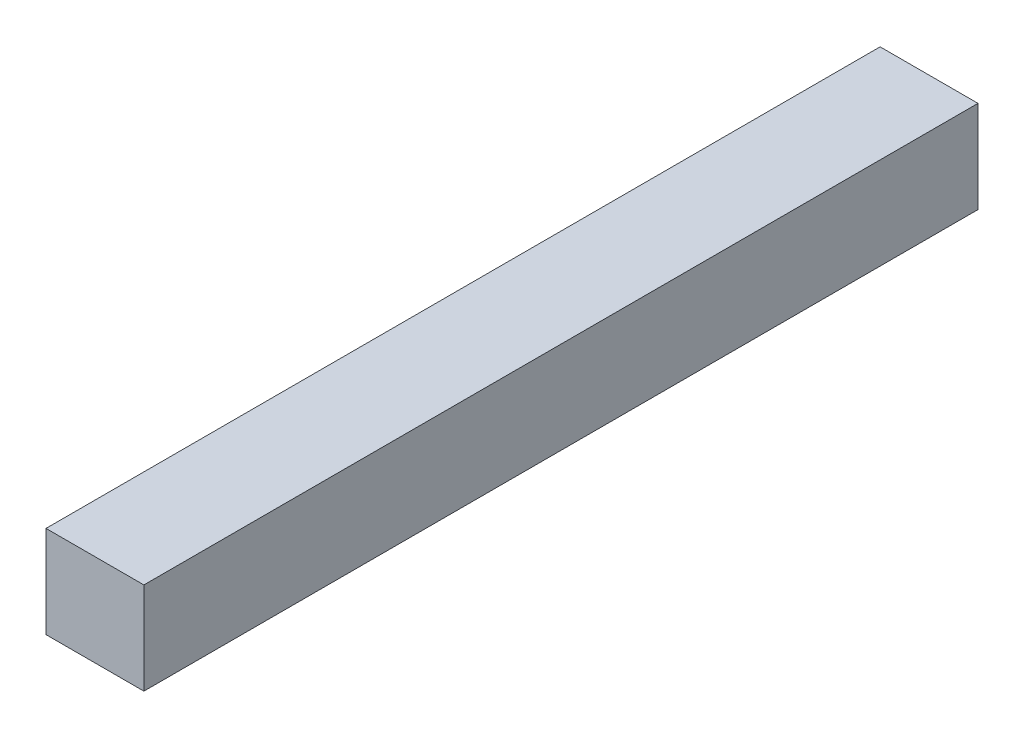
ISO-10303-21;
HEADER;
FILE_DESCRIPTION(('STEP AP214'),'2;1');
FILE_NAME('part.step','',(''),(''),'','','');
FILE_SCHEMA(('AUTOMOTIVE_DESIGN { 1 0 10303 214 1 1 1 1 }'));
ENDSEC;
DATA;
#1=APPLICATION_CONTEXT('core data for automotive mechanical design processes');
#2=APPLICATION_PROTOCOL_DEFINITION('international standard','automotive_design',2000,#1);
#3=PRODUCT_CONTEXT('',#1,'mechanical');
#4=PRODUCT('Part','Part','',(#3));
#5=PRODUCT_RELATED_PRODUCT_CATEGORY('part','',(#4));
#6=PRODUCT_DEFINITION_FORMATION('','',#4);
#7=PRODUCT_DEFINITION_CONTEXT('part definition',#1,'design');
#8=PRODUCT_DEFINITION('design','',#6,#7);
#9=PRODUCT_DEFINITION_SHAPE('','',#8);
#10=(LENGTH_UNIT() NAMED_UNIT(*) SI_UNIT(.MILLI.,.METRE.));
#11=(NAMED_UNIT(*) PLANE_ANGLE_UNIT() SI_UNIT($,.RADIAN.));
#12=(NAMED_UNIT(*) SI_UNIT($,.STERADIAN.) SOLID_ANGLE_UNIT());
#13=UNCERTAINTY_MEASURE_WITH_UNIT(LENGTH_MEASURE(1.E-05),#10,'distance_accuracy_value','');
#14=(GEOMETRIC_REPRESENTATION_CONTEXT(3) GLOBAL_UNCERTAINTY_ASSIGNED_CONTEXT((#13)) GLOBAL_UNIT_ASSIGNED_CONTEXT((#10,
#11,#12)) REPRESENTATION_CONTEXT('',''));
#15=CARTESIAN_POINT('',(0.,0.,0.));
#16=DIRECTION('',(0.,0.,1.));
#17=DIRECTION('',(1.,0.,0.));
#18=AXIS2_PLACEMENT_3D('',#15,#16,#17);
#19=CARTESIAN_POINT('',(-25.0818586999691,18.7096774193548,426.));
#20=DIRECTION('',(1.,0.,0.));
#21=DIRECTION('',(0.,1.,0.));
#22=AXIS2_PLACEMENT_3D('',#19,#20,#21);
#23=PLANE('',#22);
#24=DIRECTION('',(0.,-1.,0.));
#25=VECTOR('',#24,1.);
#26=CARTESIAN_POINT('',(-25.0818586999691,18.7096774193548,0.));
#27=LINE('',#26,#25);
#28=CARTESIAN_POINT('',(-25.0818586999691,18.7096774193548,0.));
#29=VERTEX_POINT('',#28);
#30=CARTESIAN_POINT('',(-25.0818586999691,-28.2903225806452,0.));
#31=VERTEX_POINT('',#30);
#32=EDGE_CURVE('E107',#29,#31,#27,.T.);
#33=ORIENTED_EDGE('',*,*,#32,.T.);
#34=DIRECTION('',(0.,0.,-1.));
#35=VECTOR('',#34,1.);
#36=CARTESIAN_POINT('',(-25.0818586999691,-28.2903225806452,426.));
#37=LINE('',#36,#35);
#38=CARTESIAN_POINT('',(-25.0818586999691,-28.2903225806452,426.));
#39=VERTEX_POINT('',#38);
#40=EDGE_CURVE('E11',#39,#31,#37,.T.);
#41=ORIENTED_EDGE('',*,*,#40,.F.);
#42=DIRECTION('',(0.,-1.,0.));
#43=VECTOR('',#42,1.);
#44=CARTESIAN_POINT('',(-25.0818586999691,18.7096774193548,426.));
#45=LINE('',#44,#43);
#46=CARTESIAN_POINT('',(-25.0818586999691,18.7096774193548,426.));
#47=VERTEX_POINT('',#46);
#48=EDGE_CURVE('E91',#47,#39,#45,.T.);
#49=ORIENTED_EDGE('',*,*,#48,.F.);
#50=DIRECTION('',(0.,0.,-1.));
#51=VECTOR('',#50,1.);
#52=CARTESIAN_POINT('',(-25.0818586999691,18.7096774193548,426.));
#53=LINE('',#52,#51);
#54=EDGE_CURVE('E103',#47,#29,#53,.T.);
#55=ORIENTED_EDGE('',*,*,#54,.T.);
#56=EDGE_LOOP('',(#33,#41,#49,#55));
#57=FACE_BOUND('',#56,.T.);
#58=ADVANCED_FACE('F39',(#57),#23,.F.);
#59=CARTESIAN_POINT('',(-25.0818586999691,-28.2903225806452,426.));
#60=DIRECTION('',(0.,1.,0.));
#61=DIRECTION('',(0.,0.,1.));
#62=AXIS2_PLACEMENT_3D('',#59,#60,#61);
#63=PLANE('',#62);
#64=DIRECTION('',(1.,0.,0.));
#65=VECTOR('',#64,1.);
#66=CARTESIAN_POINT('',(-25.0818586999691,-28.2903225806452,0.));
#67=LINE('',#66,#65);
#68=CARTESIAN_POINT('',(24.9181413000309,-28.2903225806452,0.));
#69=VERTEX_POINT('',#68);
#70=EDGE_CURVE('E96',#31,#69,#67,.T.);
#71=ORIENTED_EDGE('',*,*,#70,.T.);
#72=DIRECTION('',(0.,0.,-1.));
#73=VECTOR('',#72,1.);
#74=CARTESIAN_POINT('',(24.9181413000309,-28.2903225806452,426.));
#75=LINE('',#74,#73);
#76=CARTESIAN_POINT('',(24.9181413000309,-28.2903225806452,426.));
#77=VERTEX_POINT('',#76);
#78=EDGE_CURVE('E48',#77,#69,#75,.T.);
#79=ORIENTED_EDGE('',*,*,#78,.F.);
#80=DIRECTION('',(1.,0.,0.));
#81=VECTOR('',#80,1.);
#82=CARTESIAN_POINT('',(-25.0818586999691,-28.2903225806452,426.));
#83=LINE('',#82,#81);
#84=EDGE_CURVE('E86',#39,#77,#83,.T.);
#85=ORIENTED_EDGE('',*,*,#84,.F.);
#86=ORIENTED_EDGE('',*,*,#40,.T.);
#87=EDGE_LOOP('',(#71,#79,#85,#86));
#88=FACE_BOUND('',#87,.T.);
#89=ADVANCED_FACE('F95',(#88),#63,.F.);
#90=CARTESIAN_POINT('',(24.9181413000309,18.7096774193548,426.));
#91=DIRECTION('',(-1.,0.,0.));
#92=DIRECTION('',(0.,-1.,0.));
#93=AXIS2_PLACEMENT_3D('',#90,#91,#92);
#94=PLANE('',#93);
#95=DIRECTION('',(0.,1.,0.));
#96=VECTOR('',#95,1.);
#97=CARTESIAN_POINT('',(24.9181413000309,18.7096774193548,0.));
#98=LINE('',#97,#96);
#99=CARTESIAN_POINT('',(24.9181413000309,18.7096774193548,0.));
#100=VERTEX_POINT('',#99);
#101=EDGE_CURVE('E73',#69,#100,#98,.T.);
#102=ORIENTED_EDGE('',*,*,#101,.T.);
#103=DIRECTION('',(0.,0.,-1.));
#104=VECTOR('',#103,1.);
#105=CARTESIAN_POINT('',(24.9181413000309,18.7096774193548,426.));
#106=LINE('',#105,#104);
#107=CARTESIAN_POINT('',(24.9181413000309,18.7096774193548,426.));
#108=VERTEX_POINT('',#107);
#109=EDGE_CURVE('E98',#108,#100,#106,.T.);
#110=ORIENTED_EDGE('',*,*,#109,.F.);
#111=DIRECTION('',(0.,1.,0.));
#112=VECTOR('',#111,1.);
#113=CARTESIAN_POINT('',(24.9181413000309,18.7096774193548,426.));
#114=LINE('',#113,#112);
#115=EDGE_CURVE('E89',#77,#108,#114,.T.);
#116=ORIENTED_EDGE('',*,*,#115,.F.);
#117=ORIENTED_EDGE('',*,*,#78,.T.);
#118=EDGE_LOOP('',(#102,#110,#116,#117));
#119=FACE_BOUND('',#118,.T.);
#120=ADVANCED_FACE('F99',(#119),#94,.F.);
#121=CARTESIAN_POINT('',(-25.0818586999691,18.7096774193548,426.));
#122=DIRECTION('',(0.,-1.,0.));
#123=DIRECTION('',(0.,0.,-1.));
#124=AXIS2_PLACEMENT_3D('',#121,#122,#123);
#125=PLANE('',#124);
#126=DIRECTION('',(-1.,0.,0.));
#127=VECTOR('',#126,1.);
#128=CARTESIAN_POINT('',(-25.0818586999691,18.7096774193548,0.));
#129=LINE('',#128,#127);
#130=EDGE_CURVE('E79',#100,#29,#129,.T.);
#131=ORIENTED_EDGE('',*,*,#130,.T.);
#132=ORIENTED_EDGE('',*,*,#54,.F.);
#133=DIRECTION('',(-1.,0.,0.));
#134=VECTOR('',#133,1.);
#135=CARTESIAN_POINT('',(-25.0818586999691,18.7096774193548,426.));
#136=LINE('',#135,#134);
#137=EDGE_CURVE('E56',#108,#47,#136,.T.);
#138=ORIENTED_EDGE('',*,*,#137,.F.);
#139=ORIENTED_EDGE('',*,*,#109,.T.);
#140=EDGE_LOOP('',(#131,#132,#138,#139));
#141=FACE_BOUND('',#140,.T.);
#142=ADVANCED_FACE('F120',(#141),#125,.F.);
#143=CARTESIAN_POINT('',(0.,0.,426.));
#144=DIRECTION('',(0.,0.,1.));
#145=DIRECTION('',(1.,0.,0.));
#146=AXIS2_PLACEMENT_3D('',#143,#144,#145);
#147=PLANE('',#146);
#148=ORIENTED_EDGE('',*,*,#48,.T.);
#149=ORIENTED_EDGE('',*,*,#84,.T.);
#150=ORIENTED_EDGE('',*,*,#115,.T.);
#151=ORIENTED_EDGE('',*,*,#137,.T.);
#152=EDGE_LOOP('',(#148,#149,#150,#151));
#153=FACE_BOUND('',#152,.T.);
#154=ADVANCED_FACE('F87',(#153),#147,.T.);
#155=CARTESIAN_POINT('',(0.,0.,0.));
#156=DIRECTION('',(0.,0.,1.));
#157=DIRECTION('',(1.,0.,0.));
#158=AXIS2_PLACEMENT_3D('',#155,#156,#157);
#159=PLANE('',#158);
#160=ORIENTED_EDGE('',*,*,#32,.F.);
#161=ORIENTED_EDGE('',*,*,#130,.F.);
#162=ORIENTED_EDGE('',*,*,#101,.F.);
#163=ORIENTED_EDGE('',*,*,#70,.F.);
#164=EDGE_LOOP('',(#160,#161,#162,#163));
#165=FACE_BOUND('',#164,.T.);
#166=ADVANCED_FACE('F123',(#165),#159,.F.);
#167=CLOSED_SHELL('',(#58,#89,#120,#142,#154,#166));
#168=MANIFOLD_SOLID_BREP('B2',#167);
#169=ADVANCED_BREP_SHAPE_REPRESENTATION('',(#18,#168),#14);
#170=SHAPE_DEFINITION_REPRESENTATION(#9,#169);
ENDSEC;
END-ISO-10303-21;
